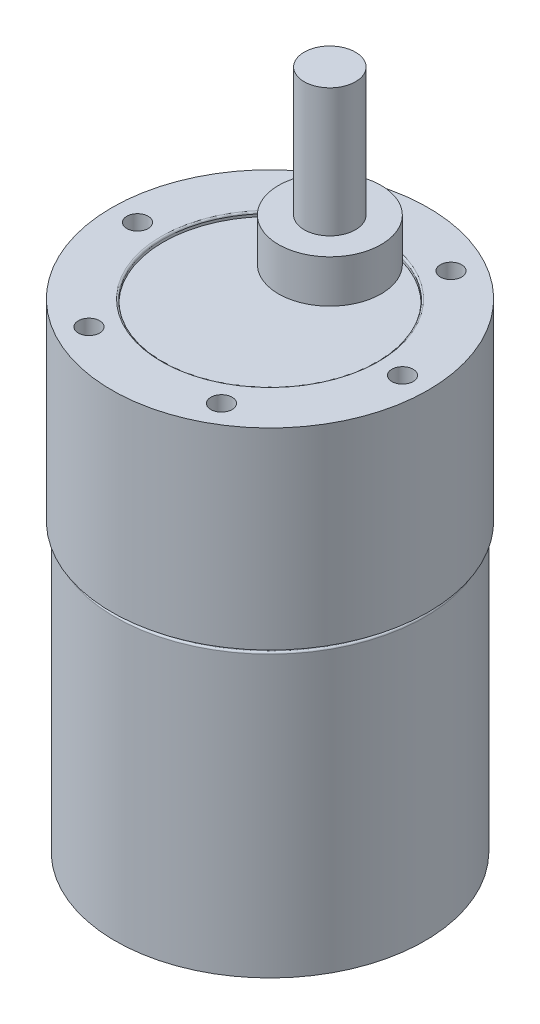
ISO-10303-21;
HEADER;
FILE_DESCRIPTION(('STEP AP214'),'2;1');
FILE_NAME('part.step','',(''),(''),'','','');
FILE_SCHEMA(('AUTOMOTIVE_DESIGN { 1 0 10303 214 1 1 1 1 }'));
ENDSEC;
DATA;
#1=APPLICATION_CONTEXT('core data for automotive mechanical design processes');
#2=APPLICATION_PROTOCOL_DEFINITION('international standard','automotive_design',2000,#1);
#3=PRODUCT_CONTEXT('',#1,'mechanical');
#4=PRODUCT('Part','Part','',(#3));
#5=PRODUCT_RELATED_PRODUCT_CATEGORY('part','',(#4));
#6=PRODUCT_DEFINITION_FORMATION('','',#4);
#7=PRODUCT_DEFINITION_CONTEXT('part definition',#1,'design');
#8=PRODUCT_DEFINITION('design','',#6,#7);
#9=PRODUCT_DEFINITION_SHAPE('','',#8);
#10=(LENGTH_UNIT() NAMED_UNIT(*) SI_UNIT(.MILLI.,.METRE.));
#11=(NAMED_UNIT(*) PLANE_ANGLE_UNIT() SI_UNIT($,.RADIAN.));
#12=(NAMED_UNIT(*) SI_UNIT($,.STERADIAN.) SOLID_ANGLE_UNIT());
#13=UNCERTAINTY_MEASURE_WITH_UNIT(LENGTH_MEASURE(1.E-05),#10,'distance_accuracy_value','');
#14=(GEOMETRIC_REPRESENTATION_CONTEXT(3) GLOBAL_UNCERTAINTY_ASSIGNED_CONTEXT((#13)) GLOBAL_UNIT_ASSIGNED_CONTEXT((#10,
#11,#12)) REPRESENTATION_CONTEXT('',''));
#15=CARTESIAN_POINT('',(0.,0.,0.));
#16=DIRECTION('',(0.,0.,1.));
#17=DIRECTION('',(1.,0.,0.));
#18=AXIS2_PLACEMENT_3D('',#15,#16,#17);
#19=CARTESIAN_POINT('',(0.,20.,-7.));
#20=DIRECTION('',(0.,1.,0.));
#21=DIRECTION('',(1.,0.,0.));
#22=AXIS2_PLACEMENT_3D('',#19,#20,#21);
#23=PLANE('',#22);
#24=CARTESIAN_POINT('',(0.,20.,-7.));
#25=DIRECTION('',(0.,1.,0.));
#26=DIRECTION('',(-1.,0.,0.));
#27=AXIS2_PLACEMENT_3D('',#24,#25,#26);
#28=CIRCLE('',#27,3.);
#29=CARTESIAN_POINT('',(-3.,20.,-7.));
#30=VERTEX_POINT('',#29);
#31=EDGE_CURVE('E216',#30,#30,#28,.T.);
#32=ORIENTED_EDGE('',*,*,#31,.T.);
#33=EDGE_LOOP('',(#32));
#34=FACE_BOUND('',#33,.T.);
#35=ADVANCED_FACE('F16',(#34),#23,.T.);
#36=CARTESIAN_POINT('',(0.,0.,-7.));
#37=DIRECTION('',(0.,1.,0.));
#38=DIRECTION('',(1.,0.,0.));
#39=AXIS2_PLACEMENT_3D('',#36,#37,#38);
#40=PLANE('',#39);
#41=CARTESIAN_POINT('',(0.,0.,0.));
#42=DIRECTION('',(0.,1.,0.));
#43=DIRECTION('',(-1.,0.,0.));
#44=AXIS2_PLACEMENT_3D('',#41,#42,#43);
#45=CIRCLE('',#44,12.7);
#46=CARTESIAN_POINT('',(2.51103269673689,0.,-12.4492857142857));
#47=VERTEX_POINT('',#46);
#48=CARTESIAN_POINT('',(-2.51103269673689,0.,-12.4492857142857));
#49=VERTEX_POINT('',#48);
#50=EDGE_CURVE('E11',#47,#49,#45,.T.);
#51=ORIENTED_EDGE('',*,*,#50,.F.);
#52=CARTESIAN_POINT('',(0.,0.,-7.));
#53=DIRECTION('',(0.,1.,0.));
#54=DIRECTION('',(-1.,0.,0.));
#55=AXIS2_PLACEMENT_3D('',#52,#53,#54);
#56=CIRCLE('',#55,6.);
#57=EDGE_CURVE('E41',#49,#47,#56,.T.);
#58=ORIENTED_EDGE('',*,*,#57,.F.);
#59=EDGE_LOOP('',(#51,#58));
#60=FACE_BOUND('',#59,.T.);
#61=ADVANCED_FACE('F94',(#60),#40,.F.);
#62=CARTESIAN_POINT('',(12.5,-0.5,0.));
#63=DIRECTION('',(0.,-1.,0.));
#64=DIRECTION('',(0.,0.,-1.));
#65=AXIS2_PLACEMENT_3D('',#62,#63,#64);
#66=PLANE('',#65);
#67=CARTESIAN_POINT('',(0.,-0.5,0.));
#68=DIRECTION('',(0.,1.,0.));
#69=DIRECTION('',(-1.,0.,0.));
#70=AXIS2_PLACEMENT_3D('',#67,#68,#69);
#71=CIRCLE('',#70,12.5);
#72=CARTESIAN_POINT('',(-12.5,-0.500000000000001,0.));
#73=VERTEX_POINT('',#72);
#74=EDGE_CURVE('E174',#73,#73,#71,.T.);
#75=ORIENTED_EDGE('',*,*,#74,.T.);
#76=EDGE_LOOP('',(#75));
#77=FACE_BOUND('',#76,.T.);
#78=ADVANCED_FACE('F100',(#77),#66,.F.);
#79=CARTESIAN_POINT('',(2.5,-57.,0.));
#80=DIRECTION('',(0.,1.,0.));
#81=DIRECTION('',(1.,0.,0.));
#82=AXIS2_PLACEMENT_3D('',#79,#80,#81);
#83=PLANE('',#82);
#84=CARTESIAN_POINT('',(0.,-57.,0.));
#85=DIRECTION('',(0.,1.,0.));
#86=DIRECTION('',(-1.,0.,0.));
#87=AXIS2_PLACEMENT_3D('',#84,#85,#86);
#88=CIRCLE('',#87,2.5);
#89=CARTESIAN_POINT('',(-2.49999999999999,-57.,0.));
#90=VERTEX_POINT('',#89);
#91=EDGE_CURVE('E160',#90,#90,#88,.T.);
#92=ORIENTED_EDGE('',*,*,#91,.F.);
#93=EDGE_LOOP('',(#92));
#94=FACE_BOUND('',#93,.T.);
#95=ADVANCED_FACE('F146',(#94),#83,.F.);
#96=CARTESIAN_POINT('',(17.6,-55.,0.));
#97=DIRECTION('',(0.,1.,0.));
#98=DIRECTION('',(1.,0.,0.));
#99=AXIS2_PLACEMENT_3D('',#96,#97,#98);
#100=PLANE('',#99);
#101=CARTESIAN_POINT('',(0.,-55.,0.));
#102=DIRECTION('',(0.,1.,0.));
#103=DIRECTION('',(-1.,0.,0.));
#104=AXIS2_PLACEMENT_3D('',#101,#102,#103);
#105=CIRCLE('',#104,3.);
#106=CARTESIAN_POINT('',(-2.99999999999999,-55.,0.));
#107=VERTEX_POINT('',#106);
#108=EDGE_CURVE('E171',#107,#107,#105,.T.);
#109=ORIENTED_EDGE('',*,*,#108,.T.);
#110=EDGE_LOOP('',(#109));
#111=FACE_BOUND('',#110,.T.);
#112=CARTESIAN_POINT('',(0.,-55.,0.));
#113=DIRECTION('',(0.,1.,0.));
#114=DIRECTION('',(-1.,0.,0.));
#115=AXIS2_PLACEMENT_3D('',#112,#113,#114);
#116=CIRCLE('',#115,17.6);
#117=CARTESIAN_POINT('',(-17.6,-55.,0.));
#118=VERTEX_POINT('',#117);
#119=EDGE_CURVE('E189',#118,#118,#116,.T.);
#120=ORIENTED_EDGE('',*,*,#119,.F.);
#121=EDGE_LOOP('',(#120));
#122=FACE_BOUND('',#121,.T.);
#123=ADVANCED_FACE('F148',(#111,#122),#100,.F.);
#124=CARTESIAN_POINT('',(18.1,-56.,0.));
#125=DIRECTION('',(0.,1.,0.));
#126=DIRECTION('',(1.,0.,0.));
#127=AXIS2_PLACEMENT_3D('',#124,#125,#126);
#128=PLANE('',#127);
#129=CARTESIAN_POINT('',(0.,-56.,0.));
#130=DIRECTION('',(0.,1.,0.));
#131=DIRECTION('',(-1.,0.,0.));
#132=AXIS2_PLACEMENT_3D('',#129,#130,#131);
#133=CIRCLE('',#132,17.6);
#134=CARTESIAN_POINT('',(-17.6,-56.,0.));
#135=VERTEX_POINT('',#134);
#136=EDGE_CURVE('E190',#135,#135,#133,.T.);
#137=ORIENTED_EDGE('',*,*,#136,.T.);
#138=EDGE_LOOP('',(#137));
#139=FACE_BOUND('',#138,.T.);
#140=CARTESIAN_POINT('',(0.,-56.,0.));
#141=DIRECTION('',(0.,1.,0.));
#142=DIRECTION('',(-1.,0.,0.));
#143=AXIS2_PLACEMENT_3D('',#140,#141,#142);
#144=CIRCLE('',#143,18.1);
#145=CARTESIAN_POINT('',(-18.1,-56.,0.));
#146=VERTEX_POINT('',#145);
#147=EDGE_CURVE('E185',#146,#146,#144,.T.);
#148=ORIENTED_EDGE('',*,*,#147,.F.);
#149=EDGE_LOOP('',(#148));
#150=FACE_BOUND('',#149,.T.);
#151=ADVANCED_FACE('F154',(#139,#150),#128,.F.);
#152=CARTESIAN_POINT('',(17.9,-23.,0.));
#153=DIRECTION('',(0.,-1.,0.));
#154=DIRECTION('',(0.,0.,-1.));
#155=AXIS2_PLACEMENT_3D('',#152,#153,#154);
#156=PLANE('',#155);
#157=CARTESIAN_POINT('',(0.,-23.,0.));
#158=DIRECTION('',(0.,1.,0.));
#159=DIRECTION('',(-1.,0.,0.));
#160=AXIS2_PLACEMENT_3D('',#157,#158,#159);
#161=CIRCLE('',#160,11.5);
#162=CARTESIAN_POINT('',(-11.5,-23.,0.));
#163=VERTEX_POINT('',#162);
#164=EDGE_CURVE('E183',#163,#163,#161,.T.);
#165=ORIENTED_EDGE('',*,*,#164,.F.);
#166=EDGE_LOOP('',(#165));
#167=FACE_BOUND('',#166,.T.);
#168=CARTESIAN_POINT('',(0.,-23.,0.));
#169=DIRECTION('',(0.,1.,0.));
#170=DIRECTION('',(-1.,0.,0.));
#171=AXIS2_PLACEMENT_3D('',#168,#169,#170);
#172=CIRCLE('',#171,17.9);
#173=CARTESIAN_POINT('',(-17.9,-23.,0.));
#174=VERTEX_POINT('',#173);
#175=EDGE_CURVE('E253',#174,#174,#172,.T.);
#176=ORIENTED_EDGE('',*,*,#175,.T.);
#177=EDGE_LOOP('',(#176));
#178=FACE_BOUND('',#177,.T.);
#179=ADVANCED_FACE('F805',(#167,#178),#156,.F.);
#180=CARTESIAN_POINT('',(11.5,-22.5,0.));
#181=DIRECTION('',(0.,1.,0.));
#182=DIRECTION('',(1.,0.,0.));
#183=AXIS2_PLACEMENT_3D('',#180,#181,#182);
#184=PLANE('',#183);
#185=CARTESIAN_POINT('',(0.,-22.5,0.));
#186=DIRECTION('',(0.,1.,0.));
#187=DIRECTION('',(-1.,0.,0.));
#188=AXIS2_PLACEMENT_3D('',#185,#186,#187);
#189=CIRCLE('',#188,11.5);
#190=CARTESIAN_POINT('',(-11.5,-22.5,0.));
#191=VERTEX_POINT('',#190);
#192=EDGE_CURVE('E179',#191,#191,#189,.T.);
#193=ORIENTED_EDGE('',*,*,#192,.T.);
#194=EDGE_LOOP('',(#193));
#195=FACE_BOUND('',#194,.T.);
#196=CARTESIAN_POINT('',(0.,-22.5,0.));
#197=DIRECTION('',(0.,1.,0.));
#198=DIRECTION('',(-1.,0.,0.));
#199=AXIS2_PLACEMENT_3D('',#196,#197,#198);
#200=CIRCLE('',#199,18.5);
#201=CARTESIAN_POINT('',(-18.5,-22.5,0.));
#202=VERTEX_POINT('',#201);
#203=EDGE_CURVE('E182',#202,#202,#200,.T.);
#204=ORIENTED_EDGE('',*,*,#203,.F.);
#205=EDGE_LOOP('',(#204));
#206=FACE_BOUND('',#205,.T.);
#207=ADVANCED_FACE('F141',(#195,#206),#184,.F.);
#208=CARTESIAN_POINT('',(18.5,0.,0.));
#209=DIRECTION('',(0.,-1.,0.));
#210=DIRECTION('',(0.,0.,-1.));
#211=AXIS2_PLACEMENT_3D('',#208,#209,#210);
#212=PLANE('',#211);
#213=CARTESIAN_POINT('',(0.,0.,-7.));
#214=DIRECTION('',(0.,1.,0.));
#215=DIRECTION('',(-1.,0.,0.));
#216=AXIS2_PLACEMENT_3D('',#213,#214,#215);
#217=CIRCLE('',#216,6.);
#218=EDGE_CURVE('E27',#47,#49,#217,.T.);
#219=ORIENTED_EDGE('',*,*,#218,.F.);
#220=CARTESIAN_POINT('',(0.,0.,0.));
#221=DIRECTION('',(0.,1.,0.));
#222=DIRECTION('',(-1.,0.,0.));
#223=AXIS2_PLACEMENT_3D('',#220,#221,#222);
#224=CIRCLE('',#223,12.7);
#225=EDGE_CURVE('E246',#49,#47,#224,.T.);
#226=ORIENTED_EDGE('',*,*,#225,.F.);
#227=EDGE_LOOP('',(#219,#226));
#228=FACE_BOUND('',#227,.T.);
#229=CARTESIAN_POINT('',(-7.75000000000016,0.,-13.4233937586587));
#230=DIRECTION('',(0.,1.,0.));
#231=DIRECTION('',(0.,0.,1.));
#232=AXIS2_PLACEMENT_3D('',#229,#230,#231);
#233=CIRCLE('',#232,1.25);
#234=CARTESIAN_POINT('',(-7.75000000000016,0.,-12.1733937586587));
#235=VERTEX_POINT('',#234);
#236=EDGE_CURVE('E265',#235,#235,#233,.T.);
#237=ORIENTED_EDGE('',*,*,#236,.F.);
#238=EDGE_LOOP('',(#237));
#239=FACE_BOUND('',#238,.T.);
#240=CARTESIAN_POINT('',(7.74999999999987,0.,-13.4233937586589));
#241=DIRECTION('',(0.,1.,0.));
#242=DIRECTION('',(0.,0.,1.));
#243=AXIS2_PLACEMENT_3D('',#240,#241,#242);
#244=CIRCLE('',#243,1.25);
#245=CARTESIAN_POINT('',(7.74999999999987,0.,-12.1733937586589));
#246=VERTEX_POINT('',#245);
#247=EDGE_CURVE('E210',#246,#246,#244,.T.);
#248=ORIENTED_EDGE('',*,*,#247,.F.);
#249=EDGE_LOOP('',(#248));
#250=FACE_BOUND('',#249,.T.);
#251=CARTESIAN_POINT('',(15.5,0.,0.));
#252=DIRECTION('',(0.,1.,0.));
#253=DIRECTION('',(0.,0.,1.));
#254=AXIS2_PLACEMENT_3D('',#251,#252,#253);
#255=CIRCLE('',#254,1.25);
#256=CARTESIAN_POINT('',(15.5,0.,1.25));
#257=VERTEX_POINT('',#256);
#258=EDGE_CURVE('E260',#257,#257,#255,.T.);
#259=ORIENTED_EDGE('',*,*,#258,.F.);
#260=EDGE_LOOP('',(#259));
#261=FACE_BOUND('',#260,.T.);
#262=CARTESIAN_POINT('',(7.75,0.,13.4233937586588));
#263=DIRECTION('',(0.,1.,0.));
#264=DIRECTION('',(0.,0.,1.));
#265=AXIS2_PLACEMENT_3D('',#262,#263,#264);
#266=CIRCLE('',#265,1.25);
#267=CARTESIAN_POINT('',(7.75,0.,14.6733937586588));
#268=VERTEX_POINT('',#267);
#269=EDGE_CURVE('E238',#268,#268,#266,.T.);
#270=ORIENTED_EDGE('',*,*,#269,.F.);
#271=EDGE_LOOP('',(#270));
#272=FACE_BOUND('',#271,.T.);
#273=CARTESIAN_POINT('',(-7.75,0.,13.4233937586588));
#274=DIRECTION('',(0.,1.,0.));
#275=DIRECTION('',(0.,0.,1.));
#276=AXIS2_PLACEMENT_3D('',#273,#274,#275);
#277=CIRCLE('',#276,1.25);
#278=CARTESIAN_POINT('',(-7.75,0.,14.6733937586588));
#279=VERTEX_POINT('',#278);
#280=EDGE_CURVE('E222',#279,#279,#277,.T.);
#281=ORIENTED_EDGE('',*,*,#280,.F.);
#282=EDGE_LOOP('',(#281));
#283=FACE_BOUND('',#282,.T.);
#284=CARTESIAN_POINT('',(-15.5,0.,0.));
#285=DIRECTION('',(0.,1.,0.));
#286=DIRECTION('',(0.,0.,1.));
#287=AXIS2_PLACEMENT_3D('',#284,#285,#286);
#288=CIRCLE('',#287,1.25);
#289=CARTESIAN_POINT('',(-15.5,0.,1.25));
#290=VERTEX_POINT('',#289);
#291=EDGE_CURVE('E20',#290,#290,#288,.T.);
#292=ORIENTED_EDGE('',*,*,#291,.F.);
#293=EDGE_LOOP('',(#292));
#294=FACE_BOUND('',#293,.T.);
#295=CARTESIAN_POINT('',(0.,0.,0.));
#296=DIRECTION('',(0.,1.,0.));
#297=DIRECTION('',(-1.,0.,0.));
#298=AXIS2_PLACEMENT_3D('',#295,#296,#297);
#299=CIRCLE('',#298,18.5);
#300=CARTESIAN_POINT('',(-18.5,0.,0.));
#301=VERTEX_POINT('',#300);
#302=EDGE_CURVE('E208',#301,#301,#299,.T.);
#303=ORIENTED_EDGE('',*,*,#302,.T.);
#304=EDGE_LOOP('',(#303));
#305=FACE_BOUND('',#304,.T.);
#306=ADVANCED_FACE('F119',(#228,#239,#250,#261,#272,#283,#294,#305),#212,.F.);
#307=CARTESIAN_POINT('',(0.,5.,-7.));
#308=DIRECTION('',(0.,1.,0.));
#309=DIRECTION('',(1.,0.,0.));
#310=AXIS2_PLACEMENT_3D('',#307,#308,#309);
#311=PLANE('',#310);
#312=CARTESIAN_POINT('',(0.,5.,-7.));
#313=DIRECTION('',(0.,1.,0.));
#314=DIRECTION('',(-1.,0.,0.));
#315=AXIS2_PLACEMENT_3D('',#312,#313,#314);
#316=CIRCLE('',#315,3.);
#317=CARTESIAN_POINT('',(-3.,5.,-7.));
#318=VERTEX_POINT('',#317);
#319=EDGE_CURVE('E218',#318,#318,#316,.T.);
#320=ORIENTED_EDGE('',*,*,#319,.F.);
#321=EDGE_LOOP('',(#320));
#322=FACE_BOUND('',#321,.T.);
#323=CARTESIAN_POINT('',(0.,5.,-7.));
#324=DIRECTION('',(0.,1.,0.));
#325=DIRECTION('',(-1.,0.,0.));
#326=AXIS2_PLACEMENT_3D('',#323,#324,#325);
#327=CIRCLE('',#326,6.);
#328=CARTESIAN_POINT('',(-6.,5.,-7.));
#329=VERTEX_POINT('',#328);
#330=EDGE_CURVE('E278',#329,#329,#327,.T.);
#331=ORIENTED_EDGE('',*,*,#330,.T.);
#332=EDGE_LOOP('',(#331));
#333=FACE_BOUND('',#332,.T.);
#334=ADVANCED_FACE('F115',(#322,#333),#311,.T.);
#335=CARTESIAN_POINT('',(0.,-0.2,0.));
#336=DIRECTION('',(0.,1.,0.));
#337=DIRECTION('',(-1.,0.,0.));
#338=AXIS2_PLACEMENT_3D('',#335,#336,#337);
#339=TOROIDAL_SURFACE('',#338,12.7,0.2);
#340=CARTESIAN_POINT('',(0.,-0.200000000000004,0.));
#341=DIRECTION('',(0.,1.,0.));
#342=DIRECTION('',(-1.,0.,0.));
#343=AXIS2_PLACEMENT_3D('',#340,#341,#342);
#344=CIRCLE('',#343,12.5);
#345=CARTESIAN_POINT('',(-12.5,-0.200000000000005,0.));
#346=VERTEX_POINT('',#345);
#347=EDGE_CURVE('E164',#346,#346,#344,.T.);
#348=ORIENTED_EDGE('',*,*,#347,.F.);
#349=EDGE_LOOP('',(#348));
#350=FACE_BOUND('',#349,.T.);
#351=ORIENTED_EDGE('',*,*,#225,.T.);
#352=ORIENTED_EDGE('',*,*,#50,.T.);
#353=EDGE_LOOP('',(#351,#352));
#354=FACE_BOUND('',#353,.T.);
#355=ADVANCED_FACE('F118',(#350,#354),#339,.T.);
#356=CARTESIAN_POINT('',(0.,-0.5,0.));
#357=DIRECTION('',(0.,1.,0.));
#358=DIRECTION('',(-1.,0.,0.));
#359=AXIS2_PLACEMENT_3D('',#356,#357,#358);
#360=CYLINDRICAL_SURFACE('',#359,18.5);
#361=ORIENTED_EDGE('',*,*,#302,.F.);
#362=EDGE_LOOP('',(#361));
#363=FACE_BOUND('',#362,.T.);
#364=ORIENTED_EDGE('',*,*,#203,.T.);
#365=EDGE_LOOP('',(#364));
#366=FACE_BOUND('',#365,.T.);
#367=ADVANCED_FACE('F487',(#363,#366),#360,.T.);
#368=CARTESIAN_POINT('',(0.,-0.5,0.));
#369=DIRECTION('',(0.,1.,0.));
#370=DIRECTION('',(-1.,0.,0.));
#371=AXIS2_PLACEMENT_3D('',#368,#369,#370);
#372=CYLINDRICAL_SURFACE('',#371,11.5);
#373=ORIENTED_EDGE('',*,*,#192,.F.);
#374=EDGE_LOOP('',(#373));
#375=FACE_BOUND('',#374,.T.);
#376=ORIENTED_EDGE('',*,*,#164,.T.);
#377=EDGE_LOOP('',(#376));
#378=FACE_BOUND('',#377,.T.);
#379=ADVANCED_FACE('F500',(#375,#378),#372,.T.);
#380=CARTESIAN_POINT('',(0.,-23.2,0.));
#381=DIRECTION('',(0.,1.,0.));
#382=DIRECTION('',(-1.,0.,0.));
#383=AXIS2_PLACEMENT_3D('',#380,#381,#382);
#384=TOROIDAL_SURFACE('',#383,17.9,0.199999999999997);
#385=ORIENTED_EDGE('',*,*,#175,.F.);
#386=EDGE_LOOP('',(#385));
#387=FACE_BOUND('',#386,.T.);
#388=CARTESIAN_POINT('',(0.,-23.2,0.));
#389=DIRECTION('',(0.,1.,0.));
#390=DIRECTION('',(-1.,0.,0.));
#391=AXIS2_PLACEMENT_3D('',#388,#389,#390);
#392=CIRCLE('',#391,18.1);
#393=CARTESIAN_POINT('',(-18.1,-23.2,0.));
#394=VERTEX_POINT('',#393);
#395=EDGE_CURVE('E188',#394,#394,#392,.T.);
#396=ORIENTED_EDGE('',*,*,#395,.T.);
#397=EDGE_LOOP('',(#396));
#398=FACE_BOUND('',#397,.T.);
#399=ADVANCED_FACE('F104',(#387,#398),#384,.T.);
#400=CARTESIAN_POINT('',(0.,-0.5,0.));
#401=DIRECTION('',(0.,1.,0.));
#402=DIRECTION('',(-1.,0.,0.));
#403=AXIS2_PLACEMENT_3D('',#400,#401,#402);
#404=CYLINDRICAL_SURFACE('',#403,18.1);
#405=ORIENTED_EDGE('',*,*,#395,.F.);
#406=EDGE_LOOP('',(#405));
#407=FACE_BOUND('',#406,.T.);
#408=ORIENTED_EDGE('',*,*,#147,.T.);
#409=EDGE_LOOP('',(#408));
#410=FACE_BOUND('',#409,.T.);
#411=ADVANCED_FACE('F110',(#407,#410),#404,.T.);
#412=CARTESIAN_POINT('',(0.,-0.5,0.));
#413=DIRECTION('',(0.,1.,0.));
#414=DIRECTION('',(-1.,0.,0.));
#415=AXIS2_PLACEMENT_3D('',#412,#413,#414);
#416=CYLINDRICAL_SURFACE('',#415,17.6);
#417=ORIENTED_EDGE('',*,*,#119,.T.);
#418=EDGE_LOOP('',(#417));
#419=FACE_BOUND('',#418,.T.);
#420=ORIENTED_EDGE('',*,*,#136,.F.);
#421=EDGE_LOOP('',(#420));
#422=FACE_BOUND('',#421,.T.);
#423=ADVANCED_FACE('F106',(#419,#422),#416,.F.);
#424=CARTESIAN_POINT('',(0.,-0.5,0.));
#425=DIRECTION('',(0.,1.,0.));
#426=DIRECTION('',(-1.,0.,0.));
#427=AXIS2_PLACEMENT_3D('',#424,#425,#426);
#428=CYLINDRICAL_SURFACE('',#427,3.);
#429=ORIENTED_EDGE('',*,*,#108,.F.);
#430=EDGE_LOOP('',(#429));
#431=FACE_BOUND('',#430,.T.);
#432=CARTESIAN_POINT('',(0.,-56.5,0.));
#433=DIRECTION('',(0.,1.,0.));
#434=DIRECTION('',(-1.,0.,0.));
#435=AXIS2_PLACEMENT_3D('',#432,#433,#434);
#436=CIRCLE('',#435,3.);
#437=CARTESIAN_POINT('',(-2.99999999999999,-56.5,0.));
#438=VERTEX_POINT('',#437);
#439=EDGE_CURVE('E163',#438,#438,#436,.T.);
#440=ORIENTED_EDGE('',*,*,#439,.T.);
#441=EDGE_LOOP('',(#440));
#442=FACE_BOUND('',#441,.T.);
#443=ADVANCED_FACE('F109',(#431,#442),#428,.T.);
#444=CARTESIAN_POINT('',(0.,-56.5,0.));
#445=DIRECTION('',(0.,1.,0.));
#446=DIRECTION('',(-1.,0.,0.));
#447=AXIS2_PLACEMENT_3D('',#444,#445,#446);
#448=TOROIDAL_SURFACE('',#447,2.5,0.5);
#449=ORIENTED_EDGE('',*,*,#439,.F.);
#450=EDGE_LOOP('',(#449));
#451=FACE_BOUND('',#450,.T.);
#452=ORIENTED_EDGE('',*,*,#91,.T.);
#453=EDGE_LOOP('',(#452));
#454=FACE_BOUND('',#453,.T.);
#455=ADVANCED_FACE('F548',(#451,#454),#448,.T.);
#456=CARTESIAN_POINT('',(0.,-0.5,0.));
#457=DIRECTION('',(0.,1.,0.));
#458=DIRECTION('',(-1.,0.,0.));
#459=AXIS2_PLACEMENT_3D('',#456,#457,#458);
#460=CYLINDRICAL_SURFACE('',#459,12.5);
#461=ORIENTED_EDGE('',*,*,#347,.T.);
#462=EDGE_LOOP('',(#461));
#463=FACE_BOUND('',#462,.T.);
#464=ORIENTED_EDGE('',*,*,#74,.F.);
#465=EDGE_LOOP('',(#464));
#466=FACE_BOUND('',#465,.T.);
#467=ADVANCED_FACE('F560',(#463,#466),#460,.F.);
#468=CARTESIAN_POINT('',(-15.5,-8.5,0.));
#469=DIRECTION('',(0.,1.,0.));
#470=DIRECTION('',(0.,0.,1.));
#471=AXIS2_PLACEMENT_3D('',#468,#469,#470);
#472=CONICAL_SURFACE('',#471,1.25,1.02974425867665);
#473=CARTESIAN_POINT('',(-15.5,-8.5,0.));
#474=DIRECTION('',(0.,1.,0.));
#475=DIRECTION('',(0.,0.,1.));
#476=AXIS2_PLACEMENT_3D('',#473,#474,#475);
#477=CIRCLE('',#476,1.25);
#478=CARTESIAN_POINT('',(-15.5,-8.5,1.25));
#479=VERTEX_POINT('',#478);
#480=EDGE_CURVE('E219',#479,#479,#477,.T.);
#481=ORIENTED_EDGE('',*,*,#480,.T.);
#482=EDGE_LOOP('',(#481));
#483=FACE_BOUND('',#482,.T.);
#484=CARTESIAN_POINT('',(-15.5,-9.25107577378445,0.));
#485=VERTEX_POINT('',#484);
#486=VERTEX_LOOP('',#485);
#487=FACE_BOUND('',#486,.T.);
#488=ADVANCED_FACE('F572',(#483,#487),#472,.F.);
#489=CARTESIAN_POINT('',(-15.5,0.,0.));
#490=DIRECTION('',(0.,1.,0.));
#491=DIRECTION('',(0.,0.,1.));
#492=AXIS2_PLACEMENT_3D('',#489,#490,#491);
#493=CYLINDRICAL_SURFACE('',#492,1.25);
#494=ORIENTED_EDGE('',*,*,#291,.T.);
#495=EDGE_LOOP('',(#494));
#496=FACE_BOUND('',#495,.T.);
#497=ORIENTED_EDGE('',*,*,#480,.F.);
#498=EDGE_LOOP('',(#497));
#499=FACE_BOUND('',#498,.T.);
#500=ADVANCED_FACE('F133',(#496,#499),#493,.F.);
#501=CARTESIAN_POINT('',(-7.75,-8.5,13.4233937586588));
#502=DIRECTION('',(0.,1.,0.));
#503=DIRECTION('',(0.,0.,1.));
#504=AXIS2_PLACEMENT_3D('',#501,#502,#503);
#505=CONICAL_SURFACE('',#504,1.25,1.02974425867665);
#506=CARTESIAN_POINT('',(-7.75,-8.5,13.4233937586588));
#507=DIRECTION('',(0.,1.,0.));
#508=DIRECTION('',(0.,0.,1.));
#509=AXIS2_PLACEMENT_3D('',#506,#507,#508);
#510=CIRCLE('',#509,1.25);
#511=CARTESIAN_POINT('',(-7.75,-8.5,14.6733937586588));
#512=VERTEX_POINT('',#511);
#513=EDGE_CURVE('E231',#512,#512,#510,.T.);
#514=ORIENTED_EDGE('',*,*,#513,.T.);
#515=EDGE_LOOP('',(#514));
#516=FACE_BOUND('',#515,.T.);
#517=CARTESIAN_POINT('',(-7.75,-9.25107577378445,13.4233937586588));
#518=VERTEX_POINT('',#517);
#519=VERTEX_LOOP('',#518);
#520=FACE_BOUND('',#519,.T.);
#521=ADVANCED_FACE('F131',(#516,#520),#505,.F.);
#522=CARTESIAN_POINT('',(-7.75,0.,13.4233937586588));
#523=DIRECTION('',(0.,1.,0.));
#524=DIRECTION('',(0.,0.,1.));
#525=AXIS2_PLACEMENT_3D('',#522,#523,#524);
#526=CYLINDRICAL_SURFACE('',#525,1.25);
#527=ORIENTED_EDGE('',*,*,#280,.T.);
#528=EDGE_LOOP('',(#527));
#529=FACE_BOUND('',#528,.T.);
#530=ORIENTED_EDGE('',*,*,#513,.F.);
#531=EDGE_LOOP('',(#530));
#532=FACE_BOUND('',#531,.T.);
#533=ADVANCED_FACE('F125',(#529,#532),#526,.F.);
#534=CARTESIAN_POINT('',(7.75,-8.5,13.4233937586588));
#535=DIRECTION('',(0.,1.,0.));
#536=DIRECTION('',(0.,0.,1.));
#537=AXIS2_PLACEMENT_3D('',#534,#535,#536);
#538=CONICAL_SURFACE('',#537,1.25,1.02974425867665);
#539=CARTESIAN_POINT('',(7.75,-8.5,13.4233937586588));
#540=DIRECTION('',(0.,1.,0.));
#541=DIRECTION('',(0.,0.,1.));
#542=AXIS2_PLACEMENT_3D('',#539,#540,#541);
#543=CIRCLE('',#542,1.25);
#544=CARTESIAN_POINT('',(7.75,-8.5,14.6733937586588));
#545=VERTEX_POINT('',#544);
#546=EDGE_CURVE('E242',#545,#545,#543,.T.);
#547=ORIENTED_EDGE('',*,*,#546,.T.);
#548=EDGE_LOOP('',(#547));
#549=FACE_BOUND('',#548,.T.);
#550=CARTESIAN_POINT('',(7.75,-9.25107577378445,13.4233937586588));
#551=VERTEX_POINT('',#550);
#552=VERTEX_LOOP('',#551);
#553=FACE_BOUND('',#552,.T.);
#554=ADVANCED_FACE('F121',(#549,#553),#538,.F.);
#555=CARTESIAN_POINT('',(7.75,0.,13.4233937586588));
#556=DIRECTION('',(0.,1.,0.));
#557=DIRECTION('',(0.,0.,1.));
#558=AXIS2_PLACEMENT_3D('',#555,#556,#557);
#559=CYLINDRICAL_SURFACE('',#558,1.25);
#560=ORIENTED_EDGE('',*,*,#269,.T.);
#561=EDGE_LOOP('',(#560));
#562=FACE_BOUND('',#561,.T.);
#563=ORIENTED_EDGE('',*,*,#546,.F.);
#564=EDGE_LOOP('',(#563));
#565=FACE_BOUND('',#564,.T.);
#566=ADVANCED_FACE('F124',(#562,#565),#559,.F.);
#567=CARTESIAN_POINT('',(15.5,-8.5,0.));
#568=DIRECTION('',(0.,1.,0.));
#569=DIRECTION('',(0.,0.,1.));
#570=AXIS2_PLACEMENT_3D('',#567,#568,#569);
#571=CONICAL_SURFACE('',#570,1.25,1.02974425867665);
#572=CARTESIAN_POINT('',(15.5,-8.5,0.));
#573=DIRECTION('',(0.,1.,0.));
#574=DIRECTION('',(0.,0.,1.));
#575=AXIS2_PLACEMENT_3D('',#572,#573,#574);
#576=CIRCLE('',#575,1.25);
#577=CARTESIAN_POINT('',(15.5,-8.5,1.25));
#578=VERTEX_POINT('',#577);
#579=EDGE_CURVE('E214',#578,#578,#576,.T.);
#580=ORIENTED_EDGE('',*,*,#579,.T.);
#581=EDGE_LOOP('',(#580));
#582=FACE_BOUND('',#581,.T.);
#583=CARTESIAN_POINT('',(15.5,-9.25107577378445,0.));
#584=VERTEX_POINT('',#583);
#585=VERTEX_LOOP('',#584);
#586=FACE_BOUND('',#585,.T.);
#587=ADVANCED_FACE('F88',(#582,#586),#571,.F.);
#588=CARTESIAN_POINT('',(15.5,0.,0.));
#589=DIRECTION('',(0.,1.,0.));
#590=DIRECTION('',(0.,0.,1.));
#591=AXIS2_PLACEMENT_3D('',#588,#589,#590);
#592=CYLINDRICAL_SURFACE('',#591,1.25);
#593=ORIENTED_EDGE('',*,*,#258,.T.);
#594=EDGE_LOOP('',(#593));
#595=FACE_BOUND('',#594,.T.);
#596=ORIENTED_EDGE('',*,*,#579,.F.);
#597=EDGE_LOOP('',(#596));
#598=FACE_BOUND('',#597,.T.);
#599=ADVANCED_FACE('F77',(#595,#598),#592,.F.);
#600=CARTESIAN_POINT('',(7.74999999999987,-8.5,-13.4233937586589));
#601=DIRECTION('',(0.,1.,0.));
#602=DIRECTION('',(0.,0.,1.));
#603=AXIS2_PLACEMENT_3D('',#600,#601,#602);
#604=CONICAL_SURFACE('',#603,1.25,1.02974425867665);
#605=CARTESIAN_POINT('',(7.74999999999987,-8.5,-13.4233937586589));
#606=DIRECTION('',(0.,1.,0.));
#607=DIRECTION('',(0.,0.,1.));
#608=AXIS2_PLACEMENT_3D('',#605,#606,#607);
#609=CIRCLE('',#608,1.25);
#610=CARTESIAN_POINT('',(7.74999999999987,-8.5,-12.1733937586589));
#611=VERTEX_POINT('',#610);
#612=EDGE_CURVE('E215',#611,#611,#609,.T.);
#613=ORIENTED_EDGE('',*,*,#612,.T.);
#614=EDGE_LOOP('',(#613));
#615=FACE_BOUND('',#614,.T.);
#616=CARTESIAN_POINT('',(7.74999999999987,-9.25107577378445,-13.4233937586589));
#617=VERTEX_POINT('',#616);
#618=VERTEX_LOOP('',#617);
#619=FACE_BOUND('',#618,.T.);
#620=ADVANCED_FACE('F74',(#615,#619),#604,.F.);
#621=CARTESIAN_POINT('',(7.74999999999987,0.,-13.4233937586589));
#622=DIRECTION('',(0.,1.,0.));
#623=DIRECTION('',(0.,0.,1.));
#624=AXIS2_PLACEMENT_3D('',#621,#622,#623);
#625=CYLINDRICAL_SURFACE('',#624,1.25);
#626=ORIENTED_EDGE('',*,*,#247,.T.);
#627=EDGE_LOOP('',(#626));
#628=FACE_BOUND('',#627,.T.);
#629=ORIENTED_EDGE('',*,*,#612,.F.);
#630=EDGE_LOOP('',(#629));
#631=FACE_BOUND('',#630,.T.);
#632=ADVANCED_FACE('F76',(#628,#631),#625,.F.);
#633=CARTESIAN_POINT('',(-7.75000000000016,-8.5,-13.4233937586587));
#634=DIRECTION('',(0.,1.,0.));
#635=DIRECTION('',(0.,0.,1.));
#636=AXIS2_PLACEMENT_3D('',#633,#634,#635);
#637=CONICAL_SURFACE('',#636,1.25,1.02974425867665);
#638=CARTESIAN_POINT('',(-7.75000000000016,-8.5,-13.4233937586587));
#639=DIRECTION('',(0.,1.,0.));
#640=DIRECTION('',(0.,0.,1.));
#641=AXIS2_PLACEMENT_3D('',#638,#639,#640);
#642=CIRCLE('',#641,1.25);
#643=CARTESIAN_POINT('',(-7.75000000000016,-8.5,-12.1733937586587));
#644=VERTEX_POINT('',#643);
#645=EDGE_CURVE('E261',#644,#644,#642,.T.);
#646=ORIENTED_EDGE('',*,*,#645,.T.);
#647=EDGE_LOOP('',(#646));
#648=FACE_BOUND('',#647,.T.);
#649=CARTESIAN_POINT('',(-7.75000000000016,-9.25107577378445,-13.4233937586587));
#650=VERTEX_POINT('',#649);
#651=VERTEX_LOOP('',#650);
#652=FACE_BOUND('',#651,.T.);
#653=ADVANCED_FACE('F85',(#648,#652),#637,.F.);
#654=CARTESIAN_POINT('',(-7.75000000000016,0.,-13.4233937586587));
#655=DIRECTION('',(0.,1.,0.));
#656=DIRECTION('',(0.,0.,1.));
#657=AXIS2_PLACEMENT_3D('',#654,#655,#656);
#658=CYLINDRICAL_SURFACE('',#657,1.25);
#659=ORIENTED_EDGE('',*,*,#236,.T.);
#660=EDGE_LOOP('',(#659));
#661=FACE_BOUND('',#660,.T.);
#662=ORIENTED_EDGE('',*,*,#645,.F.);
#663=EDGE_LOOP('',(#662));
#664=FACE_BOUND('',#663,.T.);
#665=ADVANCED_FACE('F129',(#661,#664),#658,.F.);
#666=CARTESIAN_POINT('',(0.,5.,-7.));
#667=DIRECTION('',(0.,-1.,0.));
#668=DIRECTION('',(1.,0.,0.));
#669=AXIS2_PLACEMENT_3D('',#666,#667,#668);
#670=CYLINDRICAL_SURFACE('',#669,6.);
#671=ORIENTED_EDGE('',*,*,#218,.T.);
#672=ORIENTED_EDGE('',*,*,#57,.T.);
#673=EDGE_LOOP('',(#671,#672));
#674=FACE_BOUND('',#673,.T.);
#675=ORIENTED_EDGE('',*,*,#330,.F.);
#676=EDGE_LOOP('',(#675));
#677=FACE_BOUND('',#676,.T.);
#678=ADVANCED_FACE('F18',(#674,#677),#670,.T.);
#679=CARTESIAN_POINT('',(0.,20.,-7.));
#680=DIRECTION('',(0.,-1.,0.));
#681=DIRECTION('',(1.,0.,0.));
#682=AXIS2_PLACEMENT_3D('',#679,#680,#681);
#683=CYLINDRICAL_SURFACE('',#682,3.);
#684=ORIENTED_EDGE('',*,*,#319,.T.);
#685=EDGE_LOOP('',(#684));
#686=FACE_BOUND('',#685,.T.);
#687=ORIENTED_EDGE('',*,*,#31,.F.);
#688=EDGE_LOOP('',(#687));
#689=FACE_BOUND('',#688,.T.);
#690=ADVANCED_FACE('F689',(#686,#689),#683,.T.);
#691=CLOSED_SHELL('',(#35,#61,#78,#95,#123,#151,#179,#207,#306,#334,#355,#367,#379,#399,#411,
#423,#443,#455,#467,#488,#500,#521,#533,#554,#566,#587,#599,#620,#632,#653,#665,#678,#690));
#692=MANIFOLD_SOLID_BREP('B1',#691);
#693=ADVANCED_BREP_SHAPE_REPRESENTATION('',(#18,#692),#14);
#694=SHAPE_DEFINITION_REPRESENTATION(#9,#693);
ENDSEC;
END-ISO-10303-21;
